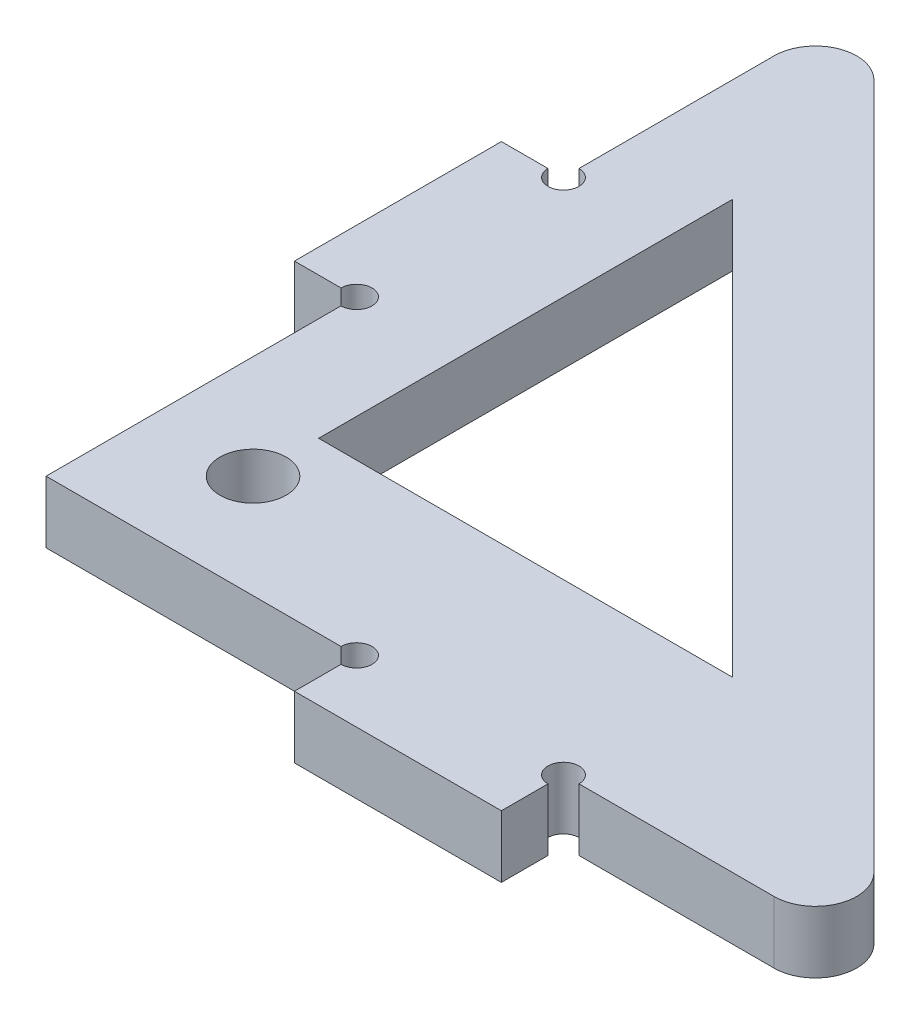
ISO-10303-21;
HEADER;
FILE_DESCRIPTION(('STEP AP214'),'2;1');
FILE_NAME('part.step','',(''),(''),'','','');
FILE_SCHEMA(('AUTOMOTIVE_DESIGN { 1 0 10303 214 1 1 1 1 }'));
ENDSEC;
DATA;
#1=APPLICATION_CONTEXT('core data for automotive mechanical design processes');
#2=APPLICATION_PROTOCOL_DEFINITION('international standard','automotive_design',2000,#1);
#3=PRODUCT_CONTEXT('',#1,'mechanical');
#4=PRODUCT('Part','Part','',(#3));
#5=PRODUCT_RELATED_PRODUCT_CATEGORY('part','',(#4));
#6=PRODUCT_DEFINITION_FORMATION('','',#4);
#7=PRODUCT_DEFINITION_CONTEXT('part definition',#1,'design');
#8=PRODUCT_DEFINITION('design','',#6,#7);
#9=PRODUCT_DEFINITION_SHAPE('','',#8);
#10=(LENGTH_UNIT() NAMED_UNIT(*) SI_UNIT(.MILLI.,.METRE.));
#11=(NAMED_UNIT(*) PLANE_ANGLE_UNIT() SI_UNIT($,.RADIAN.));
#12=(NAMED_UNIT(*) SI_UNIT($,.STERADIAN.) SOLID_ANGLE_UNIT());
#13=UNCERTAINTY_MEASURE_WITH_UNIT(LENGTH_MEASURE(1.E-05),#10,'distance_accuracy_value','');
#14=(GEOMETRIC_REPRESENTATION_CONTEXT(3) GLOBAL_UNCERTAINTY_ASSIGNED_CONTEXT((#13)) GLOBAL_UNIT_ASSIGNED_CONTEXT((#10,
#11,#12)) REPRESENTATION_CONTEXT('',''));
#15=CARTESIAN_POINT('',(0.,0.,0.));
#16=DIRECTION('',(0.,0.,1.));
#17=DIRECTION('',(1.,0.,0.));
#18=AXIS2_PLACEMENT_3D('',#15,#16,#17);
#19=CARTESIAN_POINT('',(0.,3.,0.));
#20=DIRECTION('',(0.,0.,1.));
#21=DIRECTION('',(1.,0.,0.));
#22=AXIS2_PLACEMENT_3D('',#19,#20,#21);
#23=PLANE('',#22);
#24=DIRECTION('',(-1.,0.,0.));
#25=VECTOR('',#24,1.);
#26=CARTESIAN_POINT('',(0.,0.,0.));
#27=LINE('',#26,#25);
#28=CARTESIAN_POINT('',(35.1715728752538,0.,0.));
#29=VERTEX_POINT('',#28);
#30=CARTESIAN_POINT('',(25.75,0.,0.));
#31=VERTEX_POINT('',#30);
#32=EDGE_CURVE('E254',#29,#31,#27,.T.);
#33=ORIENTED_EDGE('',*,*,#32,.F.);
#34=DIRECTION('',(0.,-1.,0.));
#35=VECTOR('',#34,1.);
#36=CARTESIAN_POINT('',(35.1715728752538,3.,0.));
#37=LINE('',#36,#35);
#38=CARTESIAN_POINT('',(35.1715728752538,3.,0.));
#39=VERTEX_POINT('',#38);
#40=EDGE_CURVE('E66',#29,#39,#37,.F.);
#41=ORIENTED_EDGE('',*,*,#40,.T.);
#42=DIRECTION('',(-1.,0.,0.));
#43=VECTOR('',#42,1.);
#44=CARTESIAN_POINT('',(0.,3.,0.));
#45=LINE('',#44,#43);
#46=CARTESIAN_POINT('',(25.75,3.,0.));
#47=VERTEX_POINT('',#46);
#48=EDGE_CURVE('E255',#39,#47,#45,.T.);
#49=ORIENTED_EDGE('',*,*,#48,.T.);
#50=DIRECTION('',(0.,1.,0.));
#51=VECTOR('',#50,1.);
#52=CARTESIAN_POINT('',(25.75,0.,0.));
#53=LINE('',#52,#51);
#54=EDGE_CURVE('E238',#31,#47,#53,.T.);
#55=ORIENTED_EDGE('',*,*,#54,.F.);
#56=EDGE_LOOP('',(#33,#41,#49,#55));
#57=FACE_BOUND('',#56,.T.);
#58=ADVANCED_FACE('F43',(#57),#23,.T.);
#59=CARTESIAN_POINT('',(20.,3.,-20.));
#60=DIRECTION('',(0.707106781186547,0.,-0.707106781186547));
#61=DIRECTION('',(-0.707106781186548,0.,-0.707106781186548));
#62=AXIS2_PLACEMENT_3D('',#59,#60,#61);
#63=PLANE('',#62);
#64=DIRECTION('',(0.707106781186548,0.,0.707106781186548));
#65=VECTOR('',#64,1.);
#66=CARTESIAN_POINT('',(20.,3.,-20.));
#67=LINE('',#66,#65);
#68=CARTESIAN_POINT('',(3.41421356237309,3.,-36.5857864376269));
#69=VERTEX_POINT('',#68);
#70=CARTESIAN_POINT('',(36.5857864376269,3.,-3.41421356237309));
#71=VERTEX_POINT('',#70);
#72=EDGE_CURVE('E257',#69,#71,#67,.T.);
#73=ORIENTED_EDGE('',*,*,#72,.T.);
#74=DIRECTION('',(0.,-1.,0.));
#75=VECTOR('',#74,1.);
#76=CARTESIAN_POINT('',(36.5857864376269,3.,-3.41421356237309));
#77=LINE('',#76,#75);
#78=CARTESIAN_POINT('',(36.5857864376269,0.,-3.41421356237309));
#79=VERTEX_POINT('',#78);
#80=EDGE_CURVE('E325',#71,#79,#77,.T.);
#81=ORIENTED_EDGE('',*,*,#80,.T.);
#82=DIRECTION('',(0.707106781186548,0.,0.707106781186548));
#83=VECTOR('',#82,1.);
#84=CARTESIAN_POINT('',(20.,0.,-20.));
#85=LINE('',#84,#83);
#86=CARTESIAN_POINT('',(3.41421356237309,0.,-36.5857864376269));
#87=VERTEX_POINT('',#86);
#88=EDGE_CURVE('E282',#87,#79,#85,.T.);
#89=ORIENTED_EDGE('',*,*,#88,.F.);
#90=DIRECTION('',(0.,-1.,0.));
#91=VECTOR('',#90,1.);
#92=CARTESIAN_POINT('',(3.41421356237309,3.,-36.5857864376269));
#93=LINE('',#92,#91);
#94=EDGE_CURVE('E323',#87,#69,#93,.F.);
#95=ORIENTED_EDGE('',*,*,#94,.T.);
#96=EDGE_LOOP('',(#73,#81,#89,#95));
#97=FACE_BOUND('',#96,.T.);
#98=ADVANCED_FACE('F338',(#97),#63,.T.);
#99=CARTESIAN_POINT('',(0.,3.,0.));
#100=DIRECTION('',(-1.,0.,0.));
#101=DIRECTION('',(0.,0.,1.));
#102=AXIS2_PLACEMENT_3D('',#99,#100,#101);
#103=PLANE('',#102);
#104=DIRECTION('',(0.,0.,-1.));
#105=VECTOR('',#104,1.);
#106=CARTESIAN_POINT('',(0.,3.,0.));
#107=LINE('',#106,#105);
#108=CARTESIAN_POINT('',(0.,3.,-25.75));
#109=VERTEX_POINT('',#108);
#110=CARTESIAN_POINT('',(0.,3.,-35.1715728752538));
#111=VERTEX_POINT('',#110);
#112=EDGE_CURVE('E262',#109,#111,#107,.T.);
#113=ORIENTED_EDGE('',*,*,#112,.T.);
#114=DIRECTION('',(0.,-1.,0.));
#115=VECTOR('',#114,1.);
#116=CARTESIAN_POINT('',(0.,3.,-35.1715728752538));
#117=LINE('',#116,#115);
#118=CARTESIAN_POINT('',(0.,0.,-35.1715728752538));
#119=VERTEX_POINT('',#118);
#120=EDGE_CURVE('E11',#111,#119,#117,.T.);
#121=ORIENTED_EDGE('',*,*,#120,.T.);
#122=DIRECTION('',(0.,0.,-1.));
#123=VECTOR('',#122,1.);
#124=CARTESIAN_POINT('',(0.,0.,0.));
#125=LINE('',#124,#123);
#126=CARTESIAN_POINT('',(0.,0.,-25.75));
#127=VERTEX_POINT('',#126);
#128=EDGE_CURVE('E286',#127,#119,#125,.T.);
#129=ORIENTED_EDGE('',*,*,#128,.F.);
#130=DIRECTION('',(0.,1.,0.));
#131=VECTOR('',#130,1.);
#132=CARTESIAN_POINT('',(0.,0.,-25.75));
#133=LINE('',#132,#131);
#134=EDGE_CURVE('E252',#109,#127,#133,.F.);
#135=ORIENTED_EDGE('',*,*,#134,.F.);
#136=EDGE_LOOP('',(#113,#121,#129,#135));
#137=FACE_BOUND('',#136,.T.);
#138=ADVANCED_FACE('F402',(#137),#103,.T.);
#139=CARTESIAN_POINT('',(0.,3.,-25.));
#140=DIRECTION('',(0.,0.,-1.));
#141=DIRECTION('',(-1.,0.,0.));
#142=AXIS2_PLACEMENT_3D('',#139,#140,#141);
#143=PLANE('',#142);
#144=DIRECTION('',(0.,1.,0.));
#145=VECTOR('',#144,1.);
#146=CARTESIAN_POINT('',(-0.75,0.,-25.));
#147=LINE('',#146,#145);
#148=CARTESIAN_POINT('',(-0.75,0.,-25.));
#149=VERTEX_POINT('',#148);
#150=CARTESIAN_POINT('',(-0.75,3.,-25.));
#151=VERTEX_POINT('',#150);
#152=EDGE_CURVE('E250',#149,#151,#147,.T.);
#153=ORIENTED_EDGE('',*,*,#152,.F.);
#154=DIRECTION('',(1.,0.,0.));
#155=VECTOR('',#154,1.);
#156=CARTESIAN_POINT('',(0.,0.,-25.));
#157=LINE('',#156,#155);
#158=CARTESIAN_POINT('',(-2.99999999999999,0.,-25.));
#159=VERTEX_POINT('',#158);
#160=EDGE_CURVE('E289',#159,#149,#157,.T.);
#161=ORIENTED_EDGE('',*,*,#160,.F.);
#162=DIRECTION('',(0.,-1.,0.));
#163=VECTOR('',#162,1.);
#164=CARTESIAN_POINT('',(-2.99999999999999,3.,-25.));
#165=LINE('',#164,#163);
#166=CARTESIAN_POINT('',(-2.99999999999999,3.,-25.));
#167=VERTEX_POINT('',#166);
#168=EDGE_CURVE('E315',#167,#159,#165,.T.);
#169=ORIENTED_EDGE('',*,*,#168,.F.);
#170=DIRECTION('',(1.,0.,0.));
#171=VECTOR('',#170,1.);
#172=CARTESIAN_POINT('',(0.,3.,-25.));
#173=LINE('',#172,#171);
#174=EDGE_CURVE('E264',#167,#151,#173,.T.);
#175=ORIENTED_EDGE('',*,*,#174,.T.);
#176=EDGE_LOOP('',(#153,#161,#169,#175));
#177=FACE_BOUND('',#176,.T.);
#178=ADVANCED_FACE('F394',(#177),#143,.T.);
#179=CARTESIAN_POINT('',(-2.99999999999998,3.,0.));
#180=DIRECTION('',(-1.,0.,0.));
#181=DIRECTION('',(0.,0.,1.));
#182=AXIS2_PLACEMENT_3D('',#179,#180,#181);
#183=PLANE('',#182);
#184=DIRECTION('',(0.,0.,-1.));
#185=VECTOR('',#184,1.);
#186=CARTESIAN_POINT('',(-2.99999999999998,0.,0.));
#187=LINE('',#186,#185);
#188=CARTESIAN_POINT('',(-2.99999999999999,0.,-15.));
#189=VERTEX_POINT('',#188);
#190=EDGE_CURVE('E293',#189,#159,#187,.T.);
#191=ORIENTED_EDGE('',*,*,#190,.F.);
#192=DIRECTION('',(0.,-1.,0.));
#193=VECTOR('',#192,1.);
#194=CARTESIAN_POINT('',(-2.99999999999999,3.,-15.));
#195=LINE('',#194,#193);
#196=CARTESIAN_POINT('',(-2.99999999999999,3.,-15.));
#197=VERTEX_POINT('',#196);
#198=EDGE_CURVE('E312',#197,#189,#195,.T.);
#199=ORIENTED_EDGE('',*,*,#198,.F.);
#200=DIRECTION('',(0.,0.,-1.));
#201=VECTOR('',#200,1.);
#202=CARTESIAN_POINT('',(-2.99999999999998,3.,0.));
#203=LINE('',#202,#201);
#204=EDGE_CURVE('E268',#197,#167,#203,.T.);
#205=ORIENTED_EDGE('',*,*,#204,.T.);
#206=ORIENTED_EDGE('',*,*,#168,.T.);
#207=EDGE_LOOP('',(#191,#199,#205,#206));
#208=FACE_BOUND('',#207,.T.);
#209=ADVANCED_FACE('F389',(#208),#183,.T.);
#210=CARTESIAN_POINT('',(0.,3.,-15.));
#211=DIRECTION('',(0.,0.,1.));
#212=DIRECTION('',(1.,0.,0.));
#213=AXIS2_PLACEMENT_3D('',#210,#211,#212);
#214=PLANE('',#213);
#215=DIRECTION('',(0.,1.,0.));
#216=VECTOR('',#215,1.);
#217=CARTESIAN_POINT('',(-0.75,0.,-15.));
#218=LINE('',#217,#216);
#219=CARTESIAN_POINT('',(-0.75,3.,-15.));
#220=VERTEX_POINT('',#219);
#221=CARTESIAN_POINT('',(-0.75,0.,-15.));
#222=VERTEX_POINT('',#221);
#223=EDGE_CURVE('E248',#220,#222,#218,.F.);
#224=ORIENTED_EDGE('',*,*,#223,.F.);
#225=DIRECTION('',(-1.,0.,0.));
#226=VECTOR('',#225,1.);
#227=CARTESIAN_POINT('',(0.,3.,-15.));
#228=LINE('',#227,#226);
#229=EDGE_CURVE('E271',#220,#197,#228,.T.);
#230=ORIENTED_EDGE('',*,*,#229,.T.);
#231=ORIENTED_EDGE('',*,*,#198,.T.);
#232=DIRECTION('',(-1.,0.,0.));
#233=VECTOR('',#232,1.);
#234=CARTESIAN_POINT('',(0.,0.,-15.));
#235=LINE('',#234,#233);
#236=EDGE_CURVE('E296',#222,#189,#235,.T.);
#237=ORIENTED_EDGE('',*,*,#236,.F.);
#238=EDGE_LOOP('',(#224,#230,#231,#237));
#239=FACE_BOUND('',#238,.T.);
#240=ADVANCED_FACE('F383',(#239),#214,.T.);
#241=DIRECTION('',(0.,1.,0.));
#242=VECTOR('',#241,1.);
#243=CARTESIAN_POINT('',(0.,0.,-14.25));
#244=LINE('',#243,#242);
#245=CARTESIAN_POINT('',(0.,0.,-14.25));
#246=VERTEX_POINT('',#245);
#247=CARTESIAN_POINT('',(0.,3.,-14.25));
#248=VERTEX_POINT('',#247);
#249=EDGE_CURVE('E246',#246,#248,#244,.T.);
#250=ORIENTED_EDGE('',*,*,#249,.F.);
#251=CARTESIAN_POINT('',(0.,0.,0.));
#252=VERTEX_POINT('',#251);
#253=EDGE_CURVE('E290',#252,#246,#125,.T.);
#254=ORIENTED_EDGE('',*,*,#253,.F.);
#255=DIRECTION('',(0.,-1.,0.));
#256=VECTOR('',#255,1.);
#257=CARTESIAN_POINT('',(0.,3.,0.));
#258=LINE('',#257,#256);
#259=CARTESIAN_POINT('',(0.,3.,0.));
#260=VERTEX_POINT('',#259);
#261=EDGE_CURVE('E309',#260,#252,#258,.T.);
#262=ORIENTED_EDGE('',*,*,#261,.F.);
#263=EDGE_CURVE('E265',#260,#248,#107,.T.);
#264=ORIENTED_EDGE('',*,*,#263,.T.);
#265=EDGE_LOOP('',(#250,#254,#262,#264));
#266=FACE_BOUND('',#265,.T.);
#267=ADVANCED_FACE('F374',(#266),#103,.T.);
#268=DIRECTION('',(0.,1.,0.));
#269=VECTOR('',#268,1.);
#270=CARTESIAN_POINT('',(14.25,0.,0.));
#271=LINE('',#270,#269);
#272=CARTESIAN_POINT('',(14.25,3.,0.));
#273=VERTEX_POINT('',#272);
#274=CARTESIAN_POINT('',(14.25,0.,0.));
#275=VERTEX_POINT('',#274);
#276=EDGE_CURVE('E244',#273,#275,#271,.F.);
#277=ORIENTED_EDGE('',*,*,#276,.F.);
#278=EDGE_CURVE('E259',#273,#260,#45,.T.);
#279=ORIENTED_EDGE('',*,*,#278,.T.);
#280=ORIENTED_EDGE('',*,*,#261,.T.);
#281=EDGE_CURVE('E283',#275,#252,#27,.T.);
#282=ORIENTED_EDGE('',*,*,#281,.F.);
#283=EDGE_LOOP('',(#277,#279,#280,#282));
#284=FACE_BOUND('',#283,.T.);
#285=ADVANCED_FACE('F378',(#284),#23,.T.);
#286=CARTESIAN_POINT('',(15.,3.,0.));
#287=DIRECTION('',(1.,0.,0.));
#288=DIRECTION('',(0.,0.,-1.));
#289=AXIS2_PLACEMENT_3D('',#286,#287,#288);
#290=PLANE('',#289);
#291=DIRECTION('',(0.,0.,1.));
#292=VECTOR('',#291,1.);
#293=CARTESIAN_POINT('',(15.,3.,0.));
#294=LINE('',#293,#292);
#295=CARTESIAN_POINT('',(15.,3.,0.750000000000002));
#296=VERTEX_POINT('',#295);
#297=CARTESIAN_POINT('',(15.,3.,3.));
#298=VERTEX_POINT('',#297);
#299=EDGE_CURVE('E273',#296,#298,#294,.T.);
#300=ORIENTED_EDGE('',*,*,#299,.F.);
#301=DIRECTION('',(0.,1.,0.));
#302=VECTOR('',#301,1.);
#303=CARTESIAN_POINT('',(15.,0.,0.750000000000002));
#304=LINE('',#303,#302);
#305=CARTESIAN_POINT('',(15.,0.,0.750000000000002));
#306=VERTEX_POINT('',#305);
#307=EDGE_CURVE('E241',#296,#306,#304,.F.);
#308=ORIENTED_EDGE('',*,*,#307,.T.);
#309=DIRECTION('',(0.,0.,1.));
#310=VECTOR('',#309,1.);
#311=CARTESIAN_POINT('',(15.,0.,0.));
#312=LINE('',#311,#310);
#313=CARTESIAN_POINT('',(15.,0.,3.));
#314=VERTEX_POINT('',#313);
#315=EDGE_CURVE('E298',#306,#314,#312,.T.);
#316=ORIENTED_EDGE('',*,*,#315,.T.);
#317=DIRECTION('',(0.,-1.,0.));
#318=VECTOR('',#317,1.);
#319=CARTESIAN_POINT('',(15.,3.,3.));
#320=LINE('',#319,#318);
#321=EDGE_CURVE('E306',#298,#314,#320,.T.);
#322=ORIENTED_EDGE('',*,*,#321,.F.);
#323=EDGE_LOOP('',(#300,#308,#316,#322));
#324=FACE_BOUND('',#323,.T.);
#325=ADVANCED_FACE('F361',(#324),#290,.F.);
#326=CARTESIAN_POINT('',(0.,3.,2.99999999999999));
#327=DIRECTION('',(0.,0.,-1.));
#328=DIRECTION('',(-1.,0.,0.));
#329=AXIS2_PLACEMENT_3D('',#326,#327,#328);
#330=PLANE('',#329);
#331=DIRECTION('',(1.,0.,0.));
#332=VECTOR('',#331,1.);
#333=CARTESIAN_POINT('',(0.,0.,2.99999999999999));
#334=LINE('',#333,#332);
#335=CARTESIAN_POINT('',(25.,0.,3.));
#336=VERTEX_POINT('',#335);
#337=EDGE_CURVE('E300',#314,#336,#334,.T.);
#338=ORIENTED_EDGE('',*,*,#337,.T.);
#339=DIRECTION('',(0.,-1.,0.));
#340=VECTOR('',#339,1.);
#341=CARTESIAN_POINT('',(25.,3.,3.));
#342=LINE('',#341,#340);
#343=CARTESIAN_POINT('',(25.,3.,3.));
#344=VERTEX_POINT('',#343);
#345=EDGE_CURVE('E280',#344,#336,#342,.T.);
#346=ORIENTED_EDGE('',*,*,#345,.F.);
#347=DIRECTION('',(1.,0.,0.));
#348=VECTOR('',#347,1.);
#349=CARTESIAN_POINT('',(0.,3.,2.99999999999999));
#350=LINE('',#349,#348);
#351=EDGE_CURVE('E275',#298,#344,#350,.T.);
#352=ORIENTED_EDGE('',*,*,#351,.F.);
#353=ORIENTED_EDGE('',*,*,#321,.T.);
#354=EDGE_LOOP('',(#338,#346,#352,#353));
#355=FACE_BOUND('',#354,.T.);
#356=ADVANCED_FACE('F357',(#355),#330,.F.);
#357=CARTESIAN_POINT('',(25.,3.,0.));
#358=DIRECTION('',(-1.,0.,0.));
#359=DIRECTION('',(0.,0.,1.));
#360=AXIS2_PLACEMENT_3D('',#357,#358,#359);
#361=PLANE('',#360);
#362=DIRECTION('',(0.,0.,-1.));
#363=VECTOR('',#362,1.);
#364=CARTESIAN_POINT('',(25.,0.,0.));
#365=LINE('',#364,#363);
#366=CARTESIAN_POINT('',(25.,0.,0.750000000000002));
#367=VERTEX_POINT('',#366);
#368=EDGE_CURVE('E258',#336,#367,#365,.T.);
#369=ORIENTED_EDGE('',*,*,#368,.T.);
#370=DIRECTION('',(0.,1.,0.));
#371=VECTOR('',#370,1.);
#372=CARTESIAN_POINT('',(25.,0.,0.750000000000002));
#373=LINE('',#372,#371);
#374=CARTESIAN_POINT('',(25.,3.,0.750000000000002));
#375=VERTEX_POINT('',#374);
#376=EDGE_CURVE('E233',#367,#375,#373,.T.);
#377=ORIENTED_EDGE('',*,*,#376,.T.);
#378=DIRECTION('',(0.,0.,-1.));
#379=VECTOR('',#378,1.);
#380=CARTESIAN_POINT('',(25.,3.,0.));
#381=LINE('',#380,#379);
#382=EDGE_CURVE('E277',#344,#375,#381,.T.);
#383=ORIENTED_EDGE('',*,*,#382,.F.);
#384=ORIENTED_EDGE('',*,*,#345,.T.);
#385=EDGE_LOOP('',(#369,#377,#383,#384));
#386=FACE_BOUND('',#385,.T.);
#387=ADVANCED_FACE('F352',(#386),#361,.F.);
#388=CARTESIAN_POINT('',(0.,3.,0.));
#389=DIRECTION('',(0.,1.,0.));
#390=DIRECTION('',(0.,0.,1.));
#391=AXIS2_PLACEMENT_3D('',#388,#389,#390);
#392=PLANE('',#391);
#393=ORIENTED_EDGE('',*,*,#48,.F.);
#394=CARTESIAN_POINT('',(35.1715728752538,3.,-2.));
#395=DIRECTION('',(0.,1.,0.));
#396=DIRECTION('',(0.,0.,1.));
#397=AXIS2_PLACEMENT_3D('',#394,#395,#396);
#398=CIRCLE('',#397,2.);
#399=EDGE_CURVE('E51',#39,#71,#398,.T.);
#400=ORIENTED_EDGE('',*,*,#399,.T.);
#401=ORIENTED_EDGE('',*,*,#72,.F.);
#402=CARTESIAN_POINT('',(2.,3.,-35.1715728752538));
#403=DIRECTION('',(0.,1.,0.));
#404=DIRECTION('',(0.,0.,1.));
#405=AXIS2_PLACEMENT_3D('',#402,#403,#404);
#406=CIRCLE('',#405,2.);
#407=EDGE_CURVE('E58',#69,#111,#406,.T.);
#408=ORIENTED_EDGE('',*,*,#407,.T.);
#409=ORIENTED_EDGE('',*,*,#112,.F.);
#410=CARTESIAN_POINT('',(0.,3.,-25.));
#411=DIRECTION('',(0.,1.,0.));
#412=DIRECTION('',(0.,0.,1.));
#413=AXIS2_PLACEMENT_3D('',#410,#411,#412);
#414=CIRCLE('',#413,0.75);
#415=EDGE_CURVE('E218',#151,#109,#414,.T.);
#416=ORIENTED_EDGE('',*,*,#415,.F.);
#417=ORIENTED_EDGE('',*,*,#174,.F.);
#418=ORIENTED_EDGE('',*,*,#204,.F.);
#419=ORIENTED_EDGE('',*,*,#229,.F.);
#420=CARTESIAN_POINT('',(0.,3.,-15.));
#421=DIRECTION('',(0.,1.,0.));
#422=DIRECTION('',(0.,0.,1.));
#423=AXIS2_PLACEMENT_3D('',#420,#421,#422);
#424=CIRCLE('',#423,0.75);
#425=EDGE_CURVE('E221',#248,#220,#424,.T.);
#426=ORIENTED_EDGE('',*,*,#425,.F.);
#427=ORIENTED_EDGE('',*,*,#263,.F.);
#428=ORIENTED_EDGE('',*,*,#278,.F.);
#429=CARTESIAN_POINT('',(15.,3.,0.));
#430=DIRECTION('',(0.,1.,0.));
#431=DIRECTION('',(0.,0.,1.));
#432=AXIS2_PLACEMENT_3D('',#429,#430,#431);
#433=CIRCLE('',#432,0.750000000000002);
#434=EDGE_CURVE('E226',#296,#273,#433,.T.);
#435=ORIENTED_EDGE('',*,*,#434,.F.);
#436=ORIENTED_EDGE('',*,*,#299,.T.);
#437=ORIENTED_EDGE('',*,*,#351,.T.);
#438=ORIENTED_EDGE('',*,*,#382,.T.);
#439=CARTESIAN_POINT('',(25.,3.,0.));
#440=DIRECTION('',(0.,1.,0.));
#441=DIRECTION('',(0.,0.,1.));
#442=AXIS2_PLACEMENT_3D('',#439,#440,#441);
#443=CIRCLE('',#442,0.750000000000002);
#444=EDGE_CURVE('E205',#47,#375,#443,.T.);
#445=ORIENTED_EDGE('',*,*,#444,.F.);
#446=EDGE_LOOP('',(#393,#400,#401,#408,#409,#416,#417,#418,#419,#426,#427,#428,#435,#436,#437,
#438,#445));
#447=FACE_BOUND('',#446,.T.);
#448=DIRECTION('',(-0.707106781186548,0.,-0.707106781186548));
#449=VECTOR('',#448,1.);
#450=CARTESIAN_POINT('',(25.,3.,-8.16976045454529));
#451=LINE('',#450,#449);
#452=CARTESIAN_POINT('',(25.,3.,-8.16976045454529));
#453=VERTEX_POINT('',#452);
#454=CARTESIAN_POINT('',(5.,3.,-28.1697604545453));
#455=VERTEX_POINT('',#454);
#456=EDGE_CURVE('E186',#453,#455,#451,.T.);
#457=ORIENTED_EDGE('',*,*,#456,.F.);
#458=DIRECTION('',(1.,0.,0.));
#459=VECTOR('',#458,1.);
#460=CARTESIAN_POINT('',(5.,3.,-8.16976045454529));
#461=LINE('',#460,#459);
#462=CARTESIAN_POINT('',(5.,3.,-8.16976045454529));
#463=VERTEX_POINT('',#462);
#464=EDGE_CURVE('E195',#463,#453,#461,.T.);
#465=ORIENTED_EDGE('',*,*,#464,.F.);
#466=DIRECTION('',(0.,0.,1.));
#467=VECTOR('',#466,1.);
#468=CARTESIAN_POINT('',(5.,3.,-28.1697604545453));
#469=LINE('',#468,#467);
#470=EDGE_CURVE('E201',#455,#463,#469,.T.);
#471=ORIENTED_EDGE('',*,*,#470,.F.);
#472=EDGE_LOOP('',(#457,#465,#471));
#473=FACE_BOUND('',#472,.T.);
#474=CARTESIAN_POINT('',(5.,3.,-5.));
#475=DIRECTION('',(0.,1.,0.));
#476=DIRECTION('',(0.,0.,1.));
#477=AXIS2_PLACEMENT_3D('',#474,#475,#476);
#478=CIRCLE('',#477,1.6);
#479=CARTESIAN_POINT('',(5.,3.,-3.4));
#480=VERTEX_POINT('',#479);
#481=EDGE_CURVE('E220',#480,#480,#478,.T.);
#482=ORIENTED_EDGE('',*,*,#481,.F.);
#483=EDGE_LOOP('',(#482));
#484=FACE_BOUND('',#483,.T.);
#485=ADVANCED_FACE('F203',(#447,#473,#484),#392,.T.);
#486=CARTESIAN_POINT('',(0.,0.,0.));
#487=DIRECTION('',(0.,1.,0.));
#488=DIRECTION('',(0.,0.,1.));
#489=AXIS2_PLACEMENT_3D('',#486,#487,#488);
#490=PLANE('',#489);
#491=DIRECTION('',(1.,0.,0.));
#492=VECTOR('',#491,1.);
#493=CARTESIAN_POINT('',(5.,0.,-8.16976045454529));
#494=LINE('',#493,#492);
#495=CARTESIAN_POINT('',(5.,0.,-8.16976045454529));
#496=VERTEX_POINT('',#495);
#497=CARTESIAN_POINT('',(25.,0.,-8.16976045454529));
#498=VERTEX_POINT('',#497);
#499=EDGE_CURVE('E211',#496,#498,#494,.T.);
#500=ORIENTED_EDGE('',*,*,#499,.T.);
#501=DIRECTION('',(-0.707106781186548,0.,-0.707106781186548));
#502=VECTOR('',#501,1.);
#503=CARTESIAN_POINT('',(25.,0.,-8.16976045454529));
#504=LINE('',#503,#502);
#505=CARTESIAN_POINT('',(5.,0.,-28.1697604545453));
#506=VERTEX_POINT('',#505);
#507=EDGE_CURVE('E189',#498,#506,#504,.T.);
#508=ORIENTED_EDGE('',*,*,#507,.T.);
#509=DIRECTION('',(0.,0.,1.));
#510=VECTOR('',#509,1.);
#511=CARTESIAN_POINT('',(5.,0.,-28.1697604545453));
#512=LINE('',#511,#510);
#513=EDGE_CURVE('E213',#506,#496,#512,.T.);
#514=ORIENTED_EDGE('',*,*,#513,.T.);
#515=EDGE_LOOP('',(#500,#508,#514));
#516=FACE_BOUND('',#515,.T.);
#517=CARTESIAN_POINT('',(5.,0.,-5.));
#518=DIRECTION('',(0.,1.,0.));
#519=DIRECTION('',(0.,0.,1.));
#520=AXIS2_PLACEMENT_3D('',#517,#518,#519);
#521=CIRCLE('',#520,1.6);
#522=CARTESIAN_POINT('',(5.,0.,-3.4));
#523=VERTEX_POINT('',#522);
#524=EDGE_CURVE('E230',#523,#523,#521,.T.);
#525=ORIENTED_EDGE('',*,*,#524,.T.);
#526=EDGE_LOOP('',(#525));
#527=FACE_BOUND('',#526,.T.);
#528=ORIENTED_EDGE('',*,*,#88,.T.);
#529=CARTESIAN_POINT('',(35.1715728752538,0.,-2.));
#530=DIRECTION('',(0.,1.,0.));
#531=DIRECTION('',(0.,0.,1.));
#532=AXIS2_PLACEMENT_3D('',#529,#530,#531);
#533=CIRCLE('',#532,2.);
#534=EDGE_CURVE('E330',#79,#29,#533,.F.);
#535=ORIENTED_EDGE('',*,*,#534,.T.);
#536=ORIENTED_EDGE('',*,*,#32,.T.);
#537=CARTESIAN_POINT('',(25.,0.,0.));
#538=DIRECTION('',(0.,1.,0.));
#539=DIRECTION('',(0.,0.,1.));
#540=AXIS2_PLACEMENT_3D('',#537,#538,#539);
#541=CIRCLE('',#540,0.750000000000002);
#542=EDGE_CURVE('E317',#31,#367,#541,.T.);
#543=ORIENTED_EDGE('',*,*,#542,.T.);
#544=ORIENTED_EDGE('',*,*,#368,.F.);
#545=ORIENTED_EDGE('',*,*,#337,.F.);
#546=ORIENTED_EDGE('',*,*,#315,.F.);
#547=CARTESIAN_POINT('',(15.,0.,0.));
#548=DIRECTION('',(0.,1.,0.));
#549=DIRECTION('',(0.,0.,1.));
#550=AXIS2_PLACEMENT_3D('',#547,#548,#549);
#551=CIRCLE('',#550,0.750000000000002);
#552=EDGE_CURVE('E207',#306,#275,#551,.T.);
#553=ORIENTED_EDGE('',*,*,#552,.T.);
#554=ORIENTED_EDGE('',*,*,#281,.T.);
#555=ORIENTED_EDGE('',*,*,#253,.T.);
#556=CARTESIAN_POINT('',(0.,0.,-15.));
#557=DIRECTION('',(0.,1.,0.));
#558=DIRECTION('',(0.,0.,1.));
#559=AXIS2_PLACEMENT_3D('',#556,#557,#558);
#560=CIRCLE('',#559,0.75);
#561=EDGE_CURVE('E223',#246,#222,#560,.T.);
#562=ORIENTED_EDGE('',*,*,#561,.T.);
#563=ORIENTED_EDGE('',*,*,#236,.T.);
#564=ORIENTED_EDGE('',*,*,#190,.T.);
#565=ORIENTED_EDGE('',*,*,#160,.T.);
#566=CARTESIAN_POINT('',(0.,0.,-25.));
#567=DIRECTION('',(0.,1.,0.));
#568=DIRECTION('',(0.,0.,1.));
#569=AXIS2_PLACEMENT_3D('',#566,#567,#568);
#570=CIRCLE('',#569,0.75);
#571=EDGE_CURVE('E320',#149,#127,#570,.T.);
#572=ORIENTED_EDGE('',*,*,#571,.T.);
#573=ORIENTED_EDGE('',*,*,#128,.T.);
#574=CARTESIAN_POINT('',(2.,0.,-35.1715728752538));
#575=DIRECTION('',(0.,1.,0.));
#576=DIRECTION('',(0.,0.,1.));
#577=AXIS2_PLACEMENT_3D('',#574,#575,#576);
#578=CIRCLE('',#577,2.);
#579=EDGE_CURVE('E328',#119,#87,#578,.F.);
#580=ORIENTED_EDGE('',*,*,#579,.T.);
#581=EDGE_LOOP('',(#528,#535,#536,#543,#544,#545,#546,#553,#554,#555,#562,#563,#564,#565,#572,
#573,#580));
#582=FACE_BOUND('',#581,.T.);
#583=ADVANCED_FACE('F343',(#516,#527,#582),#490,.F.);
#584=CARTESIAN_POINT('',(5.,0.,-5.));
#585=DIRECTION('',(0.,1.,0.));
#586=DIRECTION('',(0.,0.,1.));
#587=AXIS2_PLACEMENT_3D('',#584,#585,#586);
#588=CYLINDRICAL_SURFACE('',#587,1.6);
#589=ORIENTED_EDGE('',*,*,#524,.F.);
#590=EDGE_LOOP('',(#589));
#591=FACE_BOUND('',#590,.T.);
#592=ORIENTED_EDGE('',*,*,#481,.T.);
#593=EDGE_LOOP('',(#592));
#594=FACE_BOUND('',#593,.T.);
#595=ADVANCED_FACE('F482',(#591,#594),#588,.F.);
#596=CARTESIAN_POINT('',(25.,0.,-8.16976045454529));
#597=DIRECTION('',(0.707106781186547,0.,-0.707106781186547));
#598=DIRECTION('',(-0.707106781186548,0.,-0.707106781186548));
#599=AXIS2_PLACEMENT_3D('',#596,#597,#598);
#600=PLANE('',#599);
#601=ORIENTED_EDGE('',*,*,#456,.T.);
#602=DIRECTION('',(0.,1.,0.));
#603=VECTOR('',#602,1.);
#604=CARTESIAN_POINT('',(5.,0.,-28.1697604545453));
#605=LINE('',#604,#603);
#606=EDGE_CURVE('E214',#506,#455,#605,.T.);
#607=ORIENTED_EDGE('',*,*,#606,.F.);
#608=ORIENTED_EDGE('',*,*,#507,.F.);
#609=DIRECTION('',(0.,1.,0.));
#610=VECTOR('',#609,1.);
#611=CARTESIAN_POINT('',(25.,0.,-8.16976045454529));
#612=LINE('',#611,#610);
#613=EDGE_CURVE('E182',#498,#453,#612,.T.);
#614=ORIENTED_EDGE('',*,*,#613,.T.);
#615=EDGE_LOOP('',(#601,#607,#608,#614));
#616=FACE_BOUND('',#615,.T.);
#617=ADVANCED_FACE('F184',(#616),#600,.F.);
#618=CARTESIAN_POINT('',(5.,0.,-8.16976045454529));
#619=DIRECTION('',(0.,0.,1.));
#620=DIRECTION('',(1.,0.,0.));
#621=AXIS2_PLACEMENT_3D('',#618,#619,#620);
#622=PLANE('',#621);
#623=ORIENTED_EDGE('',*,*,#464,.T.);
#624=ORIENTED_EDGE('',*,*,#613,.F.);
#625=ORIENTED_EDGE('',*,*,#499,.F.);
#626=DIRECTION('',(0.,1.,0.));
#627=VECTOR('',#626,1.);
#628=CARTESIAN_POINT('',(5.,0.,-8.16976045454529));
#629=LINE('',#628,#627);
#630=EDGE_CURVE('E192',#496,#463,#629,.T.);
#631=ORIENTED_EDGE('',*,*,#630,.T.);
#632=EDGE_LOOP('',(#623,#624,#625,#631));
#633=FACE_BOUND('',#632,.T.);
#634=ADVANCED_FACE('F196',(#633),#622,.F.);
#635=CARTESIAN_POINT('',(5.,0.,-28.1697604545453));
#636=DIRECTION('',(-1.,0.,0.));
#637=DIRECTION('',(0.,0.,1.));
#638=AXIS2_PLACEMENT_3D('',#635,#636,#637);
#639=PLANE('',#638);
#640=ORIENTED_EDGE('',*,*,#470,.T.);
#641=ORIENTED_EDGE('',*,*,#630,.F.);
#642=ORIENTED_EDGE('',*,*,#513,.F.);
#643=ORIENTED_EDGE('',*,*,#606,.T.);
#644=EDGE_LOOP('',(#640,#641,#642,#643));
#645=FACE_BOUND('',#644,.T.);
#646=ADVANCED_FACE('F514',(#645),#639,.F.);
#647=CARTESIAN_POINT('',(25.,0.,0.));
#648=DIRECTION('',(0.,1.,0.));
#649=DIRECTION('',(0.,0.,1.));
#650=AXIS2_PLACEMENT_3D('',#647,#648,#649);
#651=CYLINDRICAL_SURFACE('',#650,0.750000000000002);
#652=ORIENTED_EDGE('',*,*,#54,.T.);
#653=ORIENTED_EDGE('',*,*,#444,.T.);
#654=ORIENTED_EDGE('',*,*,#376,.F.);
#655=ORIENTED_EDGE('',*,*,#542,.F.);
#656=EDGE_LOOP('',(#652,#653,#654,#655));
#657=FACE_BOUND('',#656,.T.);
#658=ADVANCED_FACE('F347',(#657),#651,.F.);
#659=CARTESIAN_POINT('',(15.,0.,0.));
#660=DIRECTION('',(0.,1.,0.));
#661=DIRECTION('',(0.,0.,1.));
#662=AXIS2_PLACEMENT_3D('',#659,#660,#661);
#663=CYLINDRICAL_SURFACE('',#662,0.750000000000002);
#664=ORIENTED_EDGE('',*,*,#276,.T.);
#665=ORIENTED_EDGE('',*,*,#552,.F.);
#666=ORIENTED_EDGE('',*,*,#307,.F.);
#667=ORIENTED_EDGE('',*,*,#434,.T.);
#668=EDGE_LOOP('',(#664,#665,#666,#667));
#669=FACE_BOUND('',#668,.T.);
#670=ADVANCED_FACE('F364',(#669),#663,.F.);
#671=CARTESIAN_POINT('',(0.,0.,-15.));
#672=DIRECTION('',(0.,1.,0.));
#673=DIRECTION('',(0.,0.,1.));
#674=AXIS2_PLACEMENT_3D('',#671,#672,#673);
#675=CYLINDRICAL_SURFACE('',#674,0.75);
#676=ORIENTED_EDGE('',*,*,#223,.T.);
#677=ORIENTED_EDGE('',*,*,#561,.F.);
#678=ORIENTED_EDGE('',*,*,#249,.T.);
#679=ORIENTED_EDGE('',*,*,#425,.T.);
#680=EDGE_LOOP('',(#676,#677,#678,#679));
#681=FACE_BOUND('',#680,.T.);
#682=ADVANCED_FACE('F540',(#681),#675,.F.);
#683=CARTESIAN_POINT('',(0.,0.,-25.));
#684=DIRECTION('',(0.,1.,0.));
#685=DIRECTION('',(0.,0.,1.));
#686=AXIS2_PLACEMENT_3D('',#683,#684,#685);
#687=CYLINDRICAL_SURFACE('',#686,0.75);
#688=ORIENTED_EDGE('',*,*,#134,.T.);
#689=ORIENTED_EDGE('',*,*,#571,.F.);
#690=ORIENTED_EDGE('',*,*,#152,.T.);
#691=ORIENTED_EDGE('',*,*,#415,.T.);
#692=EDGE_LOOP('',(#688,#689,#690,#691));
#693=FACE_BOUND('',#692,.T.);
#694=ADVANCED_FACE('F398',(#693),#687,.F.);
#695=CARTESIAN_POINT('',(35.1715728752538,3.,-2.));
#696=DIRECTION('',(0.,-1.,0.));
#697=DIRECTION('',(0.,0.,-1.));
#698=AXIS2_PLACEMENT_3D('',#695,#696,#697);
#699=CYLINDRICAL_SURFACE('',#698,2.);
#700=ORIENTED_EDGE('',*,*,#399,.F.);
#701=ORIENTED_EDGE('',*,*,#40,.F.);
#702=ORIENTED_EDGE('',*,*,#534,.F.);
#703=ORIENTED_EDGE('',*,*,#80,.F.);
#704=EDGE_LOOP('',(#700,#701,#702,#703));
#705=FACE_BOUND('',#704,.T.);
#706=ADVANCED_FACE('F341',(#705),#699,.T.);
#707=CARTESIAN_POINT('',(2.,3.,-35.1715728752538));
#708=DIRECTION('',(0.,-1.,0.));
#709=DIRECTION('',(0.,0.,-1.));
#710=AXIS2_PLACEMENT_3D('',#707,#708,#709);
#711=CYLINDRICAL_SURFACE('',#710,2.);
#712=ORIENTED_EDGE('',*,*,#407,.F.);
#713=ORIENTED_EDGE('',*,*,#94,.F.);
#714=ORIENTED_EDGE('',*,*,#579,.F.);
#715=ORIENTED_EDGE('',*,*,#120,.F.);
#716=EDGE_LOOP('',(#712,#713,#714,#715));
#717=FACE_BOUND('',#716,.T.);
#718=ADVANCED_FACE('F45',(#717),#711,.T.);
#719=CLOSED_SHELL('',(#58,#98,#138,#178,#209,#240,#267,#285,#325,#356,#387,#485,#583,#595,#617,
#634,#646,#658,#670,#682,#694,#706,#718));
#720=MANIFOLD_SOLID_BREP('B2',#719);
#721=ADVANCED_BREP_SHAPE_REPRESENTATION('',(#18,#720),#14);
#722=SHAPE_DEFINITION_REPRESENTATION(#9,#721);
ENDSEC;
END-ISO-10303-21;
